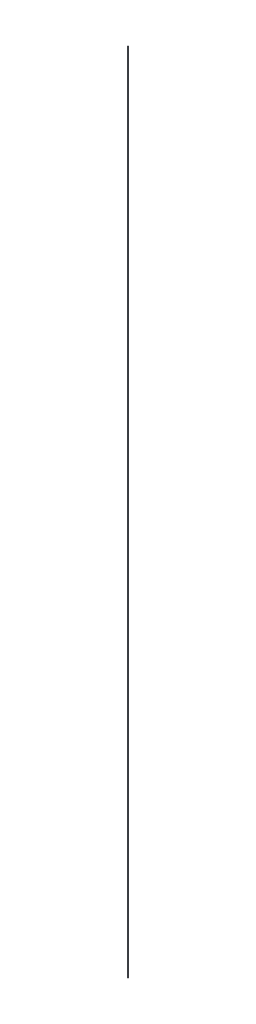
ISO-10303-21;
HEADER;
FILE_DESCRIPTION(('STEP AP214'),'2;1');
FILE_NAME('part.step','',(''),(''),'','','');
FILE_SCHEMA(('AUTOMOTIVE_DESIGN { 1 0 10303 214 1 1 1 1 }'));
ENDSEC;
DATA;
#1=APPLICATION_CONTEXT('core data for automotive mechanical design processes');
#2=APPLICATION_PROTOCOL_DEFINITION('international standard','automotive_design',2000,#1);
#3=PRODUCT_CONTEXT('',#1,'mechanical');
#4=PRODUCT('Part','Part','',(#3));
#5=PRODUCT_RELATED_PRODUCT_CATEGORY('part','',(#4));
#6=PRODUCT_DEFINITION_FORMATION('','',#4);
#7=PRODUCT_DEFINITION_CONTEXT('part definition',#1,'design');
#8=PRODUCT_DEFINITION('design','',#6,#7);
#9=PRODUCT_DEFINITION_SHAPE('','',#8);
#10=(LENGTH_UNIT() NAMED_UNIT(*) SI_UNIT(.MILLI.,.METRE.));
#11=(NAMED_UNIT(*) PLANE_ANGLE_UNIT() SI_UNIT($,.RADIAN.));
#12=(NAMED_UNIT(*) SI_UNIT($,.STERADIAN.) SOLID_ANGLE_UNIT());
#13=UNCERTAINTY_MEASURE_WITH_UNIT(LENGTH_MEASURE(1.E-05),#10,'distance_accuracy_value','');
#14=(GEOMETRIC_REPRESENTATION_CONTEXT(3) GLOBAL_UNCERTAINTY_ASSIGNED_CONTEXT((#13)) GLOBAL_UNIT_ASSIGNED_CONTEXT((#10,
#11,#12)) REPRESENTATION_CONTEXT('',''));
#15=CARTESIAN_POINT('',(0.,0.,0.));
#16=DIRECTION('',(0.,0.,1.));
#17=DIRECTION('',(1.,0.,0.));
#18=AXIS2_PLACEMENT_3D('',#15,#16,#17);
#19=CARTESIAN_POINT('',(10.,14742.953067077,7831.25184026973));
#20=DIRECTION('',(0.,0.,-1.));
#21=DIRECTION('',(-1.,0.,0.));
#22=AXIS2_PLACEMENT_3D('',#19,#20,#21);
#23=PLANE('',#22);
#24=DIRECTION('',(0.,1.,0.));
#25=VECTOR('',#24,1.);
#26=CARTESIAN_POINT('',(0.,14742.953067077,7831.25184026973));
#27=LINE('',#26,#25);
#28=CARTESIAN_POINT('',(0.,14742.953067077,7831.25184026973));
#29=VERTEX_POINT('',#28);
#30=CARTESIAN_POINT('',(0.,-14879.5971182768,7831.25184026973));
#31=VERTEX_POINT('',#30);
#32=EDGE_CURVE('E96',#29,#31,#27,.F.);
#33=ORIENTED_EDGE('',*,*,#32,.T.);
#34=DIRECTION('',(-1.,0.,0.));
#35=VECTOR('',#34,1.);
#36=CARTESIAN_POINT('',(10.,-14879.5971182768,7831.25184026973));
#37=LINE('',#36,#35);
#38=CARTESIAN_POINT('',(10.,-14879.5971182768,7831.25184026973));
#39=VERTEX_POINT('',#38);
#40=EDGE_CURVE('E11',#39,#31,#37,.T.);
#41=ORIENTED_EDGE('',*,*,#40,.F.);
#42=DIRECTION('',(0.,1.,0.));
#43=VECTOR('',#42,1.);
#44=CARTESIAN_POINT('',(10.,14742.953067077,7831.25184026973));
#45=LINE('',#44,#43);
#46=CARTESIAN_POINT('',(10.,14742.953067077,7831.25184026973));
#47=VERTEX_POINT('',#46);
#48=EDGE_CURVE('E73',#47,#39,#45,.F.);
#49=ORIENTED_EDGE('',*,*,#48,.F.);
#50=DIRECTION('',(-1.,0.,0.));
#51=VECTOR('',#50,1.);
#52=CARTESIAN_POINT('',(10.,14742.953067077,7831.25184026973));
#53=LINE('',#52,#51);
#54=EDGE_CURVE('E49',#47,#29,#53,.T.);
#55=ORIENTED_EDGE('',*,*,#54,.T.);
#56=EDGE_LOOP('',(#33,#41,#49,#55));
#57=FACE_BOUND('',#56,.T.);
#58=ADVANCED_FACE('F33',(#57),#23,.F.);
#59=CARTESIAN_POINT('',(10.,-14879.5971182768,7821.25184026974));
#60=DIRECTION('',(0.,-1.,0.));
#61=DIRECTION('',(0.,0.,-1.));
#62=AXIS2_PLACEMENT_3D('',#59,#60,#61);
#63=PLANE('',#62);
#64=DIRECTION('',(0.,0.,1.));
#65=VECTOR('',#64,1.);
#66=CARTESIAN_POINT('',(0.,-14879.5971182768,7821.25184026974));
#67=LINE('',#66,#65);
#68=CARTESIAN_POINT('',(0.,-14879.5971182768,7821.25184026974));
#69=VERTEX_POINT('',#68);
#70=EDGE_CURVE('E82',#69,#31,#67,.T.);
#71=ORIENTED_EDGE('',*,*,#70,.F.);
#72=DIRECTION('',(-1.,0.,0.));
#73=VECTOR('',#72,1.);
#74=CARTESIAN_POINT('',(10.,-14879.5971182768,7821.25184026974));
#75=LINE('',#74,#73);
#76=CARTESIAN_POINT('',(10.,-14879.5971182768,7821.25184026974));
#77=VERTEX_POINT('',#76);
#78=EDGE_CURVE('E41',#77,#69,#75,.T.);
#79=ORIENTED_EDGE('',*,*,#78,.F.);
#80=DIRECTION('',(0.,0.,1.));
#81=VECTOR('',#80,1.);
#82=CARTESIAN_POINT('',(10.,-14879.5971182768,7821.25184026974));
#83=LINE('',#82,#81);
#84=EDGE_CURVE('E80',#77,#39,#83,.T.);
#85=ORIENTED_EDGE('',*,*,#84,.T.);
#86=ORIENTED_EDGE('',*,*,#40,.T.);
#87=EDGE_LOOP('',(#71,#79,#85,#86));
#88=FACE_BOUND('',#87,.T.);
#89=ADVANCED_FACE('F79',(#88),#63,.T.);
#90=CARTESIAN_POINT('',(10.,14742.953067077,7821.25184026974));
#91=DIRECTION('',(0.,0.,-1.));
#92=DIRECTION('',(-1.,0.,0.));
#93=AXIS2_PLACEMENT_3D('',#90,#91,#92);
#94=PLANE('',#93);
#95=DIRECTION('',(0.,-1.,0.));
#96=VECTOR('',#95,1.);
#97=CARTESIAN_POINT('',(0.,14742.953067077,7821.25184026974));
#98=LINE('',#97,#96);
#99=CARTESIAN_POINT('',(0.,14742.953067077,7821.25184026974));
#100=VERTEX_POINT('',#99);
#101=EDGE_CURVE('E99',#100,#69,#98,.T.);
#102=ORIENTED_EDGE('',*,*,#101,.F.);
#103=DIRECTION('',(-1.,0.,0.));
#104=VECTOR('',#103,1.);
#105=CARTESIAN_POINT('',(10.,14742.953067077,7821.25184026974));
#106=LINE('',#105,#104);
#107=CARTESIAN_POINT('',(10.,14742.953067077,7821.25184026974));
#108=VERTEX_POINT('',#107);
#109=EDGE_CURVE('E62',#108,#100,#106,.T.);
#110=ORIENTED_EDGE('',*,*,#109,.F.);
#111=DIRECTION('',(0.,-1.,0.));
#112=VECTOR('',#111,1.);
#113=CARTESIAN_POINT('',(10.,14742.953067077,7821.25184026974));
#114=LINE('',#113,#112);
#115=EDGE_CURVE('E88',#108,#77,#114,.T.);
#116=ORIENTED_EDGE('',*,*,#115,.T.);
#117=ORIENTED_EDGE('',*,*,#78,.T.);
#118=EDGE_LOOP('',(#102,#110,#116,#117));
#119=FACE_BOUND('',#118,.T.);
#120=ADVANCED_FACE('F90',(#119),#94,.T.);
#121=CARTESIAN_POINT('',(10.,14742.953067077,7831.25184026973));
#122=DIRECTION('',(0.,1.,0.));
#123=DIRECTION('',(0.,0.,1.));
#124=AXIS2_PLACEMENT_3D('',#121,#122,#123);
#125=PLANE('',#124);
#126=DIRECTION('',(0.,0.,-1.));
#127=VECTOR('',#126,1.);
#128=CARTESIAN_POINT('',(0.,14742.953067077,7831.25184026973));
#129=LINE('',#128,#127);
#130=EDGE_CURVE('E101',#29,#100,#129,.T.);
#131=ORIENTED_EDGE('',*,*,#130,.F.);
#132=ORIENTED_EDGE('',*,*,#54,.F.);
#133=DIRECTION('',(0.,0.,-1.));
#134=VECTOR('',#133,1.);
#135=CARTESIAN_POINT('',(10.,14742.953067077,7831.25184026973));
#136=LINE('',#135,#134);
#137=EDGE_CURVE('E91',#47,#108,#136,.T.);
#138=ORIENTED_EDGE('',*,*,#137,.T.);
#139=ORIENTED_EDGE('',*,*,#109,.T.);
#140=EDGE_LOOP('',(#131,#132,#138,#139));
#141=FACE_BOUND('',#140,.T.);
#142=ADVANCED_FACE('F107',(#141),#125,.T.);
#143=CARTESIAN_POINT('',(10.,0.,0.));
#144=DIRECTION('',(1.,0.,0.));
#145=DIRECTION('',(0.,0.,-1.));
#146=AXIS2_PLACEMENT_3D('',#143,#144,#145);
#147=PLANE('',#146);
#148=ORIENTED_EDGE('',*,*,#48,.T.);
#149=ORIENTED_EDGE('',*,*,#84,.F.);
#150=ORIENTED_EDGE('',*,*,#115,.F.);
#151=ORIENTED_EDGE('',*,*,#137,.F.);
#152=EDGE_LOOP('',(#148,#149,#150,#151));
#153=FACE_BOUND('',#152,.T.);
#154=ADVANCED_FACE('F87',(#153),#147,.T.);
#155=CARTESIAN_POINT('',(0.,0.,0.));
#156=DIRECTION('',(1.,0.,0.));
#157=DIRECTION('',(0.,0.,-1.));
#158=AXIS2_PLACEMENT_3D('',#155,#156,#157);
#159=PLANE('',#158);
#160=ORIENTED_EDGE('',*,*,#32,.F.);
#161=ORIENTED_EDGE('',*,*,#130,.T.);
#162=ORIENTED_EDGE('',*,*,#101,.T.);
#163=ORIENTED_EDGE('',*,*,#70,.T.);
#164=EDGE_LOOP('',(#160,#161,#162,#163));
#165=FACE_BOUND('',#164,.T.);
#166=ADVANCED_FACE('F106',(#165),#159,.F.);
#167=CLOSED_SHELL('',(#58,#89,#120,#142,#154,#166));
#168=MANIFOLD_SOLID_BREP('B2',#167);
#169=ADVANCED_BREP_SHAPE_REPRESENTATION('',(#18,#168),#14);
#170=SHAPE_DEFINITION_REPRESENTATION(#9,#169);
ENDSEC;
END-ISO-10303-21;
